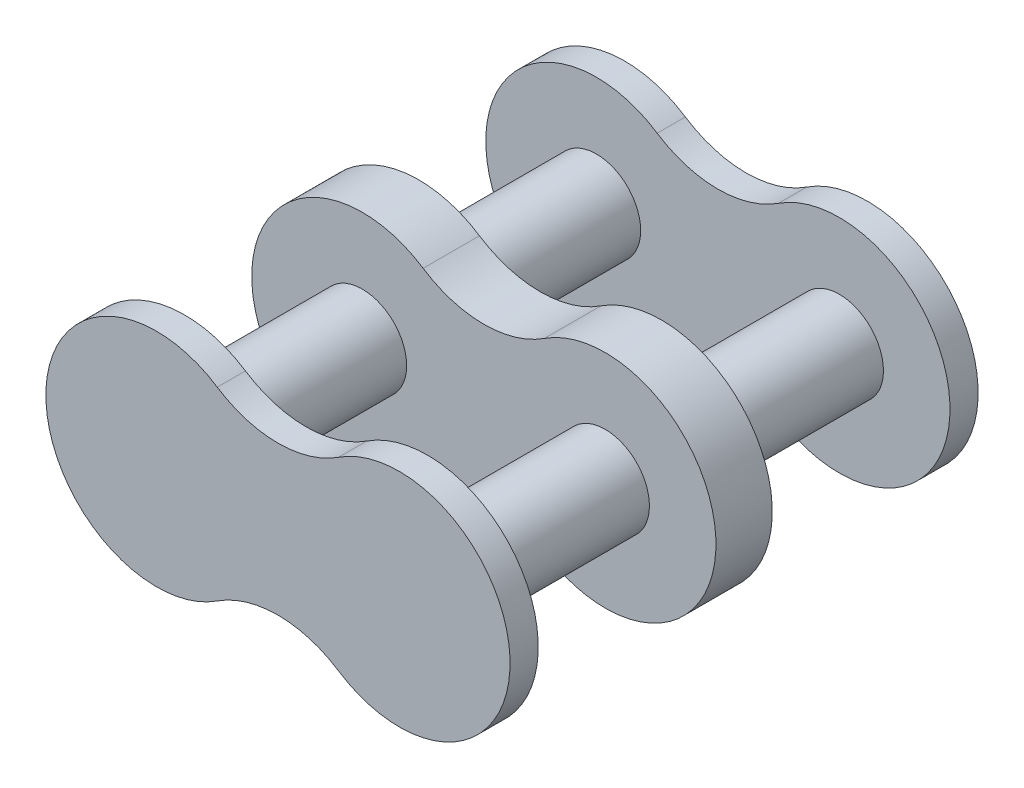
ISO-10303-21;
HEADER;
FILE_DESCRIPTION(('STEP AP214'),'2;1');
FILE_NAME('part.step','',(''),(''),'','','');
FILE_SCHEMA(('AUTOMOTIVE_DESIGN { 1 0 10303 214 1 1 1 1 }'));
ENDSEC;
DATA;
#1=APPLICATION_CONTEXT('core data for automotive mechanical design processes');
#2=APPLICATION_PROTOCOL_DEFINITION('international standard','automotive_design',2000,#1);
#3=PRODUCT_CONTEXT('',#1,'mechanical');
#4=PRODUCT('Part','Part','',(#3));
#5=PRODUCT_RELATED_PRODUCT_CATEGORY('part','',(#4));
#6=PRODUCT_DEFINITION_FORMATION('','',#4);
#7=PRODUCT_DEFINITION_CONTEXT('part definition',#1,'design');
#8=PRODUCT_DEFINITION('design','',#6,#7);
#9=PRODUCT_DEFINITION_SHAPE('','',#8);
#10=(LENGTH_UNIT() NAMED_UNIT(*) SI_UNIT(.MILLI.,.METRE.));
#11=(NAMED_UNIT(*) PLANE_ANGLE_UNIT() SI_UNIT($,.RADIAN.));
#12=(NAMED_UNIT(*) SI_UNIT($,.STERADIAN.) SOLID_ANGLE_UNIT());
#13=UNCERTAINTY_MEASURE_WITH_UNIT(LENGTH_MEASURE(1.E-05),#10,'distance_accuracy_value','');
#14=(GEOMETRIC_REPRESENTATION_CONTEXT(3) GLOBAL_UNCERTAINTY_ASSIGNED_CONTEXT((#13)) GLOBAL_UNIT_ASSIGNED_CONTEXT((#10,
#11,#12)) REPRESENTATION_CONTEXT('',''));
#15=CARTESIAN_POINT('',(0.,0.,0.));
#16=DIRECTION('',(0.,0.,1.));
#17=DIRECTION('',(1.,0.,0.));
#18=AXIS2_PLACEMENT_3D('',#15,#16,#17);
#19=CARTESIAN_POINT('',(0.,4.84328116466513,0.7366));
#20=DIRECTION('',(0.,0.,-1.));
#21=DIRECTION('',(-1.,0.,0.));
#22=AXIS2_PLACEMENT_3D('',#19,#20,#21);
#23=CYLINDRICAL_SURFACE('',#22,2.8956);
#24=CARTESIAN_POINT('',(0.,4.84328116466513,-0.7366));
#25=DIRECTION('',(0.,0.,-1.));
#26=DIRECTION('',(1.,0.,0.));
#27=AXIS2_PLACEMENT_3D('',#24,#25,#26);
#28=CIRCLE('',#27,2.8956);
#29=CARTESIAN_POINT('',(1.5875,2.42164058233256,-0.7366));
#30=VERTEX_POINT('',#29);
#31=CARTESIAN_POINT('',(-1.5875,2.42164058233256,-0.7366));
#32=VERTEX_POINT('',#31);
#33=EDGE_CURVE('E221',#30,#32,#28,.T.);
#34=ORIENTED_EDGE('',*,*,#33,.T.);
#35=DIRECTION('',(0.,0.,-1.));
#36=VECTOR('',#35,1.);
#37=CARTESIAN_POINT('',(-1.5875,2.42164058233256,0.7366));
#38=LINE('',#37,#36);
#39=CARTESIAN_POINT('',(-1.5875,2.42164058233256,0.7366));
#40=VERTEX_POINT('',#39);
#41=EDGE_CURVE('E240',#40,#32,#38,.T.);
#42=ORIENTED_EDGE('',*,*,#41,.F.);
#43=CARTESIAN_POINT('',(0.,4.84328116466513,0.7366));
#44=DIRECTION('',(0.,0.,-1.));
#45=DIRECTION('',(1.,0.,0.));
#46=AXIS2_PLACEMENT_3D('',#43,#44,#45);
#47=CIRCLE('',#46,2.8956);
#48=CARTESIAN_POINT('',(1.5875,2.42164058233256,0.7366));
#49=VERTEX_POINT('',#48);
#50=EDGE_CURVE('E222',#49,#40,#47,.T.);
#51=ORIENTED_EDGE('',*,*,#50,.F.);
#52=DIRECTION('',(0.,0.,-1.));
#53=VECTOR('',#52,1.);
#54=CARTESIAN_POINT('',(1.5875,2.42164058233256,0.7366));
#55=LINE('',#54,#53);
#56=EDGE_CURVE('E228',#49,#30,#55,.T.);
#57=ORIENTED_EDGE('',*,*,#56,.T.);
#58=EDGE_LOOP('',(#34,#42,#51,#57));
#59=FACE_BOUND('',#58,.T.);
#60=ADVANCED_FACE('F33',(#59),#23,.F.);
#61=CARTESIAN_POINT('',(-3.175,0.,0.7366));
#62=DIRECTION('',(0.,0.,-1.));
#63=DIRECTION('',(-1.,0.,0.));
#64=AXIS2_PLACEMENT_3D('',#61,#62,#63);
#65=CYLINDRICAL_SURFACE('',#64,2.8956);
#66=CARTESIAN_POINT('',(-3.175,0.,-0.7366));
#67=DIRECTION('',(0.,0.,1.));
#68=DIRECTION('',(1.,0.,0.));
#69=AXIS2_PLACEMENT_3D('',#66,#67,#68);
#70=CIRCLE('',#69,2.8956);
#71=CARTESIAN_POINT('',(-1.5875,-2.42164058233256,-0.7366));
#72=VERTEX_POINT('',#71);
#73=EDGE_CURVE('E231',#32,#72,#70,.T.);
#74=ORIENTED_EDGE('',*,*,#73,.T.);
#75=DIRECTION('',(0.,0.,-1.));
#76=VECTOR('',#75,1.);
#77=CARTESIAN_POINT('',(-1.5875,-2.42164058233256,0.7366));
#78=LINE('',#77,#76);
#79=CARTESIAN_POINT('',(-1.5875,-2.42164058233256,0.7366));
#80=VERTEX_POINT('',#79);
#81=EDGE_CURVE('E238',#80,#72,#78,.T.);
#82=ORIENTED_EDGE('',*,*,#81,.F.);
#83=CARTESIAN_POINT('',(-3.175,0.,0.7366));
#84=DIRECTION('',(0.,0.,1.));
#85=DIRECTION('',(1.,0.,0.));
#86=AXIS2_PLACEMENT_3D('',#83,#84,#85);
#87=CIRCLE('',#86,2.8956);
#88=EDGE_CURVE('E81',#40,#80,#87,.T.);
#89=ORIENTED_EDGE('',*,*,#88,.F.);
#90=ORIENTED_EDGE('',*,*,#41,.T.);
#91=EDGE_LOOP('',(#74,#82,#89,#90));
#92=FACE_BOUND('',#91,.T.);
#93=ADVANCED_FACE('F280',(#92),#65,.T.);
#94=CARTESIAN_POINT('',(0.,-4.84328116466513,0.7366));
#95=DIRECTION('',(0.,0.,-1.));
#96=DIRECTION('',(-1.,0.,0.));
#97=AXIS2_PLACEMENT_3D('',#94,#95,#96);
#98=CYLINDRICAL_SURFACE('',#97,2.8956);
#99=CARTESIAN_POINT('',(0.,-4.84328116466513,-0.7366));
#100=DIRECTION('',(0.,0.,-1.));
#101=DIRECTION('',(-1.,0.,0.));
#102=AXIS2_PLACEMENT_3D('',#99,#100,#101);
#103=CIRCLE('',#102,2.8956);
#104=CARTESIAN_POINT('',(1.5875,-2.42164058233256,-0.7366));
#105=VERTEX_POINT('',#104);
#106=EDGE_CURVE('E67',#72,#105,#103,.T.);
#107=ORIENTED_EDGE('',*,*,#106,.T.);
#108=DIRECTION('',(0.,0.,-1.));
#109=VECTOR('',#108,1.);
#110=CARTESIAN_POINT('',(1.5875,-2.42164058233256,0.7366));
#111=LINE('',#110,#109);
#112=CARTESIAN_POINT('',(1.5875,-2.42164058233256,0.7366));
#113=VERTEX_POINT('',#112);
#114=EDGE_CURVE('E236',#113,#105,#111,.T.);
#115=ORIENTED_EDGE('',*,*,#114,.F.);
#116=CARTESIAN_POINT('',(0.,-4.84328116466513,0.7366));
#117=DIRECTION('',(0.,0.,-1.));
#118=DIRECTION('',(-1.,0.,0.));
#119=AXIS2_PLACEMENT_3D('',#116,#117,#118);
#120=CIRCLE('',#119,2.8956);
#121=EDGE_CURVE('E225',#80,#113,#120,.T.);
#122=ORIENTED_EDGE('',*,*,#121,.F.);
#123=ORIENTED_EDGE('',*,*,#81,.T.);
#124=EDGE_LOOP('',(#107,#115,#122,#123));
#125=FACE_BOUND('',#124,.T.);
#126=ADVANCED_FACE('F285',(#125),#98,.F.);
#127=CARTESIAN_POINT('',(3.175,0.,0.7366));
#128=DIRECTION('',(0.,0.,-1.));
#129=DIRECTION('',(-1.,0.,0.));
#130=AXIS2_PLACEMENT_3D('',#127,#128,#129);
#131=CYLINDRICAL_SURFACE('',#130,2.8956);
#132=CARTESIAN_POINT('',(3.175,0.,-0.7366));
#133=DIRECTION('',(0.,0.,1.));
#134=DIRECTION('',(1.,0.,0.));
#135=AXIS2_PLACEMENT_3D('',#132,#133,#134);
#136=CIRCLE('',#135,2.8956);
#137=EDGE_CURVE('E73',#105,#30,#136,.T.);
#138=ORIENTED_EDGE('',*,*,#137,.T.);
#139=ORIENTED_EDGE('',*,*,#56,.F.);
#140=CARTESIAN_POINT('',(3.175,0.,0.7366));
#141=DIRECTION('',(0.,0.,1.));
#142=DIRECTION('',(1.,0.,0.));
#143=AXIS2_PLACEMENT_3D('',#140,#141,#142);
#144=CIRCLE('',#143,2.8956);
#145=EDGE_CURVE('E49',#113,#49,#144,.T.);
#146=ORIENTED_EDGE('',*,*,#145,.F.);
#147=ORIENTED_EDGE('',*,*,#114,.T.);
#148=EDGE_LOOP('',(#138,#139,#146,#147));
#149=FACE_BOUND('',#148,.T.);
#150=ADVANCED_FACE('F294',(#149),#131,.T.);
#151=CARTESIAN_POINT('',(1.5875,2.42164058233256,0.7366));
#152=DIRECTION('',(0.,0.,1.));
#153=DIRECTION('',(1.,0.,0.));
#154=AXIS2_PLACEMENT_3D('',#151,#152,#153);
#155=PLANE('',#154);
#156=CARTESIAN_POINT('',(3.175,0.,0.7366));
#157=DIRECTION('',(0.,0.,1.));
#158=DIRECTION('',(1.,0.,0.));
#159=AXIS2_PLACEMENT_3D('',#156,#157,#158);
#160=CIRCLE('',#159,1.1557);
#161=CARTESIAN_POINT('',(4.3307,0.,0.7366));
#162=VERTEX_POINT('',#161);
#163=EDGE_CURVE('E182',#162,#162,#160,.T.);
#164=ORIENTED_EDGE('',*,*,#163,.F.);
#165=EDGE_LOOP('',(#164));
#166=FACE_BOUND('',#165,.T.);
#167=CARTESIAN_POINT('',(-3.175,0.,0.7366));
#168=DIRECTION('',(0.,0.,1.));
#169=DIRECTION('',(1.,0.,0.));
#170=AXIS2_PLACEMENT_3D('',#167,#168,#169);
#171=CIRCLE('',#170,1.1557);
#172=CARTESIAN_POINT('',(-2.0193,0.,0.7366));
#173=VERTEX_POINT('',#172);
#174=EDGE_CURVE('E215',#173,#173,#171,.T.);
#175=ORIENTED_EDGE('',*,*,#174,.F.);
#176=EDGE_LOOP('',(#175));
#177=FACE_BOUND('',#176,.T.);
#178=ORIENTED_EDGE('',*,*,#50,.T.);
#179=ORIENTED_EDGE('',*,*,#88,.T.);
#180=ORIENTED_EDGE('',*,*,#121,.T.);
#181=ORIENTED_EDGE('',*,*,#145,.T.);
#182=EDGE_LOOP('',(#178,#179,#180,#181));
#183=FACE_BOUND('',#182,.T.);
#184=ADVANCED_FACE('F292',(#166,#177,#183),#155,.T.);
#185=CARTESIAN_POINT('',(1.5875,2.42164058233256,-0.7366));
#186=DIRECTION('',(0.,0.,1.));
#187=DIRECTION('',(1.,0.,0.));
#188=AXIS2_PLACEMENT_3D('',#185,#186,#187);
#189=PLANE('',#188);
#190=CARTESIAN_POINT('',(3.175,0.,-0.7366));
#191=DIRECTION('',(0.,0.,1.));
#192=DIRECTION('',(1.,0.,0.));
#193=AXIS2_PLACEMENT_3D('',#190,#191,#192);
#194=CIRCLE('',#193,1.1557);
#195=CARTESIAN_POINT('',(4.3307,0.,-0.7366));
#196=VERTEX_POINT('',#195);
#197=EDGE_CURVE('E163',#196,#196,#194,.T.);
#198=ORIENTED_EDGE('',*,*,#197,.T.);
#199=EDGE_LOOP('',(#198));
#200=FACE_BOUND('',#199,.T.);
#201=CARTESIAN_POINT('',(-3.175,0.,-0.7366));
#202=DIRECTION('',(0.,0.,1.));
#203=DIRECTION('',(1.,0.,0.));
#204=AXIS2_PLACEMENT_3D('',#201,#202,#203);
#205=CIRCLE('',#204,1.1557);
#206=CARTESIAN_POINT('',(-2.0193,0.,-0.7366));
#207=VERTEX_POINT('',#206);
#208=EDGE_CURVE('E179',#207,#207,#205,.T.);
#209=ORIENTED_EDGE('',*,*,#208,.T.);
#210=EDGE_LOOP('',(#209));
#211=FACE_BOUND('',#210,.T.);
#212=ORIENTED_EDGE('',*,*,#33,.F.);
#213=ORIENTED_EDGE('',*,*,#137,.F.);
#214=ORIENTED_EDGE('',*,*,#106,.F.);
#215=ORIENTED_EDGE('',*,*,#73,.F.);
#216=EDGE_LOOP('',(#212,#213,#214,#215));
#217=FACE_BOUND('',#216,.T.);
#218=ADVANCED_FACE('F290',(#200,#211,#217),#189,.F.);
#219=CARTESIAN_POINT('',(-3.175,0.,8.65361322806917));
#220=DIRECTION('',(0.,0.,-1.));
#221=DIRECTION('',(-1.,0.,0.));
#222=AXIS2_PLACEMENT_3D('',#219,#220,#221);
#223=CYLINDRICAL_SURFACE('',#222,1.1557);
#224=ORIENTED_EDGE('',*,*,#174,.T.);
#225=EDGE_LOOP('',(#224));
#226=FACE_BOUND('',#225,.T.);
#227=CARTESIAN_POINT('',(-3.175,0.,5.3848));
#228=DIRECTION('',(0.,0.,1.));
#229=DIRECTION('',(1.,0.,0.));
#230=AXIS2_PLACEMENT_3D('',#227,#228,#229);
#231=CIRCLE('',#230,1.1557);
#232=CARTESIAN_POINT('',(-2.0193,0.,5.3848));
#233=VERTEX_POINT('',#232);
#234=EDGE_CURVE('E218',#233,#233,#231,.T.);
#235=ORIENTED_EDGE('',*,*,#234,.F.);
#236=EDGE_LOOP('',(#235));
#237=FACE_BOUND('',#236,.T.);
#238=ADVANCED_FACE('F301',(#226,#237),#223,.T.);
#239=CARTESIAN_POINT('',(0.,4.84328116466513,6.1214));
#240=DIRECTION('',(0.,0.,-1.));
#241=DIRECTION('',(-1.,0.,0.));
#242=AXIS2_PLACEMENT_3D('',#239,#240,#241);
#243=CYLINDRICAL_SURFACE('',#242,2.8956);
#244=CARTESIAN_POINT('',(0.,4.84328116466513,5.3848));
#245=DIRECTION('',(0.,0.,-1.));
#246=DIRECTION('',(1.,0.,0.));
#247=AXIS2_PLACEMENT_3D('',#244,#245,#246);
#248=CIRCLE('',#247,2.8956);
#249=CARTESIAN_POINT('',(1.5875,2.42164058233256,5.3848));
#250=VERTEX_POINT('',#249);
#251=CARTESIAN_POINT('',(-1.5875,2.42164058233256,5.3848));
#252=VERTEX_POINT('',#251);
#253=EDGE_CURVE('E185',#250,#252,#248,.T.);
#254=ORIENTED_EDGE('',*,*,#253,.T.);
#255=DIRECTION('',(0.,0.,-1.));
#256=VECTOR('',#255,1.);
#257=CARTESIAN_POINT('',(-1.5875,2.42164058233256,6.1214));
#258=LINE('',#257,#256);
#259=CARTESIAN_POINT('',(-1.5875,2.42164058233256,6.1214));
#260=VERTEX_POINT('',#259);
#261=EDGE_CURVE('E212',#260,#252,#258,.T.);
#262=ORIENTED_EDGE('',*,*,#261,.F.);
#263=CARTESIAN_POINT('',(0.,4.84328116466513,6.1214));
#264=DIRECTION('',(0.,0.,-1.));
#265=DIRECTION('',(1.,0.,0.));
#266=AXIS2_PLACEMENT_3D('',#263,#264,#265);
#267=CIRCLE('',#266,2.8956);
#268=CARTESIAN_POINT('',(1.5875,2.42164058233256,6.1214));
#269=VERTEX_POINT('',#268);
#270=EDGE_CURVE('E186',#269,#260,#267,.T.);
#271=ORIENTED_EDGE('',*,*,#270,.F.);
#272=DIRECTION('',(0.,0.,-1.));
#273=VECTOR('',#272,1.);
#274=CARTESIAN_POINT('',(1.5875,2.42164058233256,6.1214));
#275=LINE('',#274,#273);
#276=EDGE_CURVE('E196',#269,#250,#275,.T.);
#277=ORIENTED_EDGE('',*,*,#276,.T.);
#278=EDGE_LOOP('',(#254,#262,#271,#277));
#279=FACE_BOUND('',#278,.T.);
#280=ADVANCED_FACE('F258',(#279),#243,.F.);
#281=CARTESIAN_POINT('',(-3.175,0.,6.1214));
#282=DIRECTION('',(0.,0.,-1.));
#283=DIRECTION('',(-1.,0.,0.));
#284=AXIS2_PLACEMENT_3D('',#281,#282,#283);
#285=CYLINDRICAL_SURFACE('',#284,2.8956);
#286=CARTESIAN_POINT('',(-3.175,0.,5.3848));
#287=DIRECTION('',(0.,0.,1.));
#288=DIRECTION('',(1.,0.,0.));
#289=AXIS2_PLACEMENT_3D('',#286,#287,#288);
#290=CIRCLE('',#289,2.8956);
#291=CARTESIAN_POINT('',(-1.5875,-2.42164058233256,5.3848));
#292=VERTEX_POINT('',#291);
#293=EDGE_CURVE('E199',#252,#292,#290,.T.);
#294=ORIENTED_EDGE('',*,*,#293,.T.);
#295=DIRECTION('',(0.,0.,-1.));
#296=VECTOR('',#295,1.);
#297=CARTESIAN_POINT('',(-1.5875,-2.42164058233256,6.1214));
#298=LINE('',#297,#296);
#299=CARTESIAN_POINT('',(-1.5875,-2.42164058233256,6.1214));
#300=VERTEX_POINT('',#299);
#301=EDGE_CURVE('E209',#300,#292,#298,.T.);
#302=ORIENTED_EDGE('',*,*,#301,.F.);
#303=CARTESIAN_POINT('',(-3.175,0.,6.1214));
#304=DIRECTION('',(0.,0.,1.));
#305=DIRECTION('',(1.,0.,0.));
#306=AXIS2_PLACEMENT_3D('',#303,#304,#305);
#307=CIRCLE('',#306,2.8956);
#308=EDGE_CURVE('E189',#260,#300,#307,.T.);
#309=ORIENTED_EDGE('',*,*,#308,.F.);
#310=ORIENTED_EDGE('',*,*,#261,.T.);
#311=EDGE_LOOP('',(#294,#302,#309,#310));
#312=FACE_BOUND('',#311,.T.);
#313=ADVANCED_FACE('F270',(#312),#285,.T.);
#314=CARTESIAN_POINT('',(0.,-4.84328116466513,6.1214));
#315=DIRECTION('',(0.,0.,-1.));
#316=DIRECTION('',(-1.,0.,0.));
#317=AXIS2_PLACEMENT_3D('',#314,#315,#316);
#318=CYLINDRICAL_SURFACE('',#317,2.8956);
#319=CARTESIAN_POINT('',(0.,-4.84328116466513,5.3848));
#320=DIRECTION('',(0.,0.,-1.));
#321=DIRECTION('',(-1.,0.,0.));
#322=AXIS2_PLACEMENT_3D('',#319,#320,#321);
#323=CIRCLE('',#322,2.8956);
#324=CARTESIAN_POINT('',(1.5875,-2.42164058233256,5.3848));
#325=VERTEX_POINT('',#324);
#326=EDGE_CURVE('E201',#292,#325,#323,.T.);
#327=ORIENTED_EDGE('',*,*,#326,.T.);
#328=DIRECTION('',(0.,0.,-1.));
#329=VECTOR('',#328,1.);
#330=CARTESIAN_POINT('',(1.5875,-2.42164058233256,6.1214));
#331=LINE('',#330,#329);
#332=CARTESIAN_POINT('',(1.5875,-2.42164058233256,6.1214));
#333=VERTEX_POINT('',#332);
#334=EDGE_CURVE('E206',#333,#325,#331,.T.);
#335=ORIENTED_EDGE('',*,*,#334,.F.);
#336=CARTESIAN_POINT('',(0.,-4.84328116466513,6.1214));
#337=DIRECTION('',(0.,0.,-1.));
#338=DIRECTION('',(-1.,0.,0.));
#339=AXIS2_PLACEMENT_3D('',#336,#337,#338);
#340=CIRCLE('',#339,2.8956);
#341=EDGE_CURVE('E192',#300,#333,#340,.T.);
#342=ORIENTED_EDGE('',*,*,#341,.F.);
#343=ORIENTED_EDGE('',*,*,#301,.T.);
#344=EDGE_LOOP('',(#327,#335,#342,#343));
#345=FACE_BOUND('',#344,.T.);
#346=ADVANCED_FACE('F267',(#345),#318,.F.);
#347=CARTESIAN_POINT('',(3.175,0.,6.1214));
#348=DIRECTION('',(0.,0.,-1.));
#349=DIRECTION('',(-1.,0.,0.));
#350=AXIS2_PLACEMENT_3D('',#347,#348,#349);
#351=CYLINDRICAL_SURFACE('',#350,2.8956);
#352=CARTESIAN_POINT('',(3.175,0.,5.3848));
#353=DIRECTION('',(0.,0.,1.));
#354=DIRECTION('',(1.,0.,0.));
#355=AXIS2_PLACEMENT_3D('',#352,#353,#354);
#356=CIRCLE('',#355,2.8956);
#357=EDGE_CURVE('E190',#325,#250,#356,.T.);
#358=ORIENTED_EDGE('',*,*,#357,.T.);
#359=ORIENTED_EDGE('',*,*,#276,.F.);
#360=CARTESIAN_POINT('',(3.175,0.,6.1214));
#361=DIRECTION('',(0.,0.,1.));
#362=DIRECTION('',(1.,0.,0.));
#363=AXIS2_PLACEMENT_3D('',#360,#361,#362);
#364=CIRCLE('',#363,2.8956);
#365=EDGE_CURVE('E194',#333,#269,#364,.T.);
#366=ORIENTED_EDGE('',*,*,#365,.F.);
#367=ORIENTED_EDGE('',*,*,#334,.T.);
#368=EDGE_LOOP('',(#358,#359,#366,#367));
#369=FACE_BOUND('',#368,.T.);
#370=ADVANCED_FACE('F263',(#369),#351,.T.);
#371=CARTESIAN_POINT('',(1.5875,2.42164058233256,6.1214));
#372=DIRECTION('',(0.,0.,1.));
#373=DIRECTION('',(1.,0.,0.));
#374=AXIS2_PLACEMENT_3D('',#371,#372,#373);
#375=PLANE('',#374);
#376=ORIENTED_EDGE('',*,*,#270,.T.);
#377=ORIENTED_EDGE('',*,*,#308,.T.);
#378=ORIENTED_EDGE('',*,*,#341,.T.);
#379=ORIENTED_EDGE('',*,*,#365,.T.);
#380=EDGE_LOOP('',(#376,#377,#378,#379));
#381=FACE_BOUND('',#380,.T.);
#382=ADVANCED_FACE('F249',(#381),#375,.T.);
#383=CARTESIAN_POINT('',(1.5875,2.42164058233256,5.3848));
#384=DIRECTION('',(0.,0.,1.));
#385=DIRECTION('',(1.,0.,0.));
#386=AXIS2_PLACEMENT_3D('',#383,#384,#385);
#387=PLANE('',#386);
#388=CARTESIAN_POINT('',(3.175,0.,5.3848));
#389=DIRECTION('',(0.,0.,1.));
#390=DIRECTION('',(1.,0.,0.));
#391=AXIS2_PLACEMENT_3D('',#388,#389,#390);
#392=CIRCLE('',#391,1.1557);
#393=CARTESIAN_POINT('',(4.3307,0.,5.3848));
#394=VERTEX_POINT('',#393);
#395=EDGE_CURVE('E41',#394,#394,#392,.F.);
#396=ORIENTED_EDGE('',*,*,#395,.F.);
#397=EDGE_LOOP('',(#396));
#398=FACE_BOUND('',#397,.T.);
#399=ORIENTED_EDGE('',*,*,#234,.T.);
#400=EDGE_LOOP('',(#399));
#401=FACE_BOUND('',#400,.T.);
#402=ORIENTED_EDGE('',*,*,#253,.F.);
#403=ORIENTED_EDGE('',*,*,#357,.F.);
#404=ORIENTED_EDGE('',*,*,#326,.F.);
#405=ORIENTED_EDGE('',*,*,#293,.F.);
#406=EDGE_LOOP('',(#402,#403,#404,#405));
#407=FACE_BOUND('',#406,.T.);
#408=ADVANCED_FACE('F246',(#398,#401,#407),#387,.F.);
#409=CARTESIAN_POINT('',(3.175,0.,8.65361322806917));
#410=DIRECTION('',(0.,0.,-1.));
#411=DIRECTION('',(-1.,0.,0.));
#412=AXIS2_PLACEMENT_3D('',#409,#410,#411);
#413=CYLINDRICAL_SURFACE('',#412,1.1557);
#414=ORIENTED_EDGE('',*,*,#163,.T.);
#415=EDGE_LOOP('',(#414));
#416=FACE_BOUND('',#415,.T.);
#417=ORIENTED_EDGE('',*,*,#395,.T.);
#418=EDGE_LOOP('',(#417));
#419=FACE_BOUND('',#418,.T.);
#420=ADVANCED_FACE('F244',(#416,#419),#413,.T.);
#421=CARTESIAN_POINT('',(-3.175,0.,-5.3848));
#422=DIRECTION('',(0.,0.,1.));
#423=DIRECTION('',(1.,0.,0.));
#424=AXIS2_PLACEMENT_3D('',#421,#422,#423);
#425=CYLINDRICAL_SURFACE('',#424,1.1557);
#426=CARTESIAN_POINT('',(-3.175,0.,-5.3848));
#427=DIRECTION('',(0.,0.,1.));
#428=DIRECTION('',(1.,0.,0.));
#429=AXIS2_PLACEMENT_3D('',#426,#427,#428);
#430=CIRCLE('',#429,1.1557);
#431=CARTESIAN_POINT('',(-2.0193,0.,-5.3848));
#432=VERTEX_POINT('',#431);
#433=EDGE_CURVE('E173',#432,#432,#430,.T.);
#434=CARTESIAN_POINT('',(-2.0193,0.,-5.3848));
#435=CARTESIAN_POINT('',(-2.0193,0.,-5.33638125));
#436=CARTESIAN_POINT('',(-2.0193,0.,-5.2879625));
#437=CARTESIAN_POINT('',(-2.0193,0.,-5.191125));
#438=CARTESIAN_POINT('',(-2.0193,0.,-5.14270625));
#439=CARTESIAN_POINT('',(-2.0193,0.,-5.04586875));
#440=CARTESIAN_POINT('',(-2.0193,0.,-4.99745));
#441=CARTESIAN_POINT('',(-2.0193,0.,-4.9006125));
#442=CARTESIAN_POINT('',(-2.0193,0.,-4.85219375));
#443=CARTESIAN_POINT('',(-2.0193,0.,-4.75535625));
#444=CARTESIAN_POINT('',(-2.0193,0.,-4.7069375));
#445=CARTESIAN_POINT('',(-2.0193,0.,-4.6101));
#446=CARTESIAN_POINT('',(-2.0193,0.,-4.56168125));
#447=CARTESIAN_POINT('',(-2.0193,0.,-4.46484375));
#448=CARTESIAN_POINT('',(-2.0193,0.,-4.416425));
#449=CARTESIAN_POINT('',(-2.0193,0.,-4.3195875));
#450=CARTESIAN_POINT('',(-2.0193,0.,-4.27116875));
#451=CARTESIAN_POINT('',(-2.0193,0.,-4.17433125));
#452=CARTESIAN_POINT('',(-2.0193,0.,-4.1259125));
#453=CARTESIAN_POINT('',(-2.0193,0.,-4.029075));
#454=CARTESIAN_POINT('',(-2.0193,0.,-3.98065625));
#455=CARTESIAN_POINT('',(-2.0193,0.,-3.88381875));
#456=CARTESIAN_POINT('',(-2.0193,0.,-3.8354));
#457=CARTESIAN_POINT('',(-2.0193,0.,-3.7385625));
#458=CARTESIAN_POINT('',(-2.0193,0.,-3.69014375));
#459=CARTESIAN_POINT('',(-2.0193,0.,-3.59330625));
#460=CARTESIAN_POINT('',(-2.0193,0.,-3.5448875));
#461=CARTESIAN_POINT('',(-2.0193,0.,-3.44805));
#462=CARTESIAN_POINT('',(-2.0193,0.,-3.39963125));
#463=CARTESIAN_POINT('',(-2.0193,0.,-3.30279375));
#464=CARTESIAN_POINT('',(-2.0193,0.,-3.254375));
#465=CARTESIAN_POINT('',(-2.0193,0.,-3.1575375));
#466=CARTESIAN_POINT('',(-2.0193,0.,-3.10911875));
#467=CARTESIAN_POINT('',(-2.0193,0.,-3.01228125));
#468=CARTESIAN_POINT('',(-2.0193,0.,-2.9638625));
#469=CARTESIAN_POINT('',(-2.0193,0.,-2.867025));
#470=CARTESIAN_POINT('',(-2.0193,0.,-2.81860625));
#471=CARTESIAN_POINT('',(-2.0193,0.,-2.72176875));
#472=CARTESIAN_POINT('',(-2.0193,0.,-2.67335));
#473=CARTESIAN_POINT('',(-2.0193,0.,-2.5765125));
#474=CARTESIAN_POINT('',(-2.0193,0.,-2.52809375));
#475=CARTESIAN_POINT('',(-2.0193,0.,-2.43125625));
#476=CARTESIAN_POINT('',(-2.0193,0.,-2.3828375));
#477=CARTESIAN_POINT('',(-2.0193,0.,-2.286));
#478=CARTESIAN_POINT('',(-2.0193,0.,-2.23758125));
#479=CARTESIAN_POINT('',(-2.0193,0.,-2.14074375));
#480=CARTESIAN_POINT('',(-2.0193,0.,-2.092325));
#481=CARTESIAN_POINT('',(-2.0193,0.,-1.9954875));
#482=CARTESIAN_POINT('',(-2.0193,0.,-1.94706875));
#483=CARTESIAN_POINT('',(-2.0193,0.,-1.85023125));
#484=CARTESIAN_POINT('',(-2.0193,0.,-1.8018125));
#485=CARTESIAN_POINT('',(-2.0193,0.,-1.704975));
#486=CARTESIAN_POINT('',(-2.0193,0.,-1.65655625));
#487=CARTESIAN_POINT('',(-2.0193,0.,-1.55971875));
#488=CARTESIAN_POINT('',(-2.0193,0.,-1.5113));
#489=CARTESIAN_POINT('',(-2.0193,0.,-1.4144625));
#490=CARTESIAN_POINT('',(-2.0193,0.,-1.36604375));
#491=CARTESIAN_POINT('',(-2.0193,0.,-1.26920625));
#492=CARTESIAN_POINT('',(-2.0193,0.,-1.2207875));
#493=CARTESIAN_POINT('',(-2.0193,0.,-1.12395));
#494=CARTESIAN_POINT('',(-2.0193,0.,-1.07553125));
#495=CARTESIAN_POINT('',(-2.0193,0.,-0.97869375));
#496=CARTESIAN_POINT('',(-2.0193,0.,-0.930275));
#497=CARTESIAN_POINT('',(-2.0193,0.,-0.833437499999999));
#498=CARTESIAN_POINT('',(-2.0193,0.,-0.785018749999999));
#499=CARTESIAN_POINT('',(-2.0193,0.,-0.7366));
#500=B_SPLINE_CURVE_WITH_KNOTS('',3,(#434,#435,#436,#437,#438,#439,#440,#441,#442,#443,#444,
#445,#446,#447,#448,#449,#450,#451,#452,#453,#454,#455,#456,#457,#458,#459,#460,#461,#462,#463,
#464,#465,#466,#467,#468,#469,#470,#471,#472,#473,#474,#475,#476,#477,#478,#479,#480,#481,#482,
#483,#484,#485,#486,#487,#488,#489,#490,#491,#492,#493,#494,#495,#496,#497,#498,#499),
.UNSPECIFIED.,.F.,.F.,(4,2,2,2,2,2,2,2,2,2,2,2,2,2,2,2,2,2,2,2,2,2,2,2,2,2,2,2,2,2,2,2,4),(0.,
0.145256250000001,0.2905125,0.435768750000001,0.581025000000001,0.72628125,0.871537500000001,
1.01679375,1.16205,1.30730625,1.4525625,1.59781875,1.743075,1.88833125,2.0335875,2.17884375,
2.3241,2.46935625,2.6146125,2.75986875,2.905125,3.05038125,3.1956375,3.34089375,3.48615,
3.63140625,3.7766625,3.92191875,4.067175,4.21243125,4.3576875,4.50294375,4.6482),.UNSPECIFIED.);
#501=EDGE_CURVE('BSEAM380',#432,#207,#500,.T.);
#502=ORIENTED_EDGE('',*,*,#433,.T.);
#503=ORIENTED_EDGE('',*,*,#208,.F.);
#504=ORIENTED_EDGE('',*,*,#501,.T.);
#505=ORIENTED_EDGE('',*,*,#501,.F.);
#506=EDGE_LOOP('',(#502,#504,#503,#505));
#507=FACE_BOUND('',#506,.T.);
#508=ADVANCED_FACE('F380',(#507),#425,.T.);
#509=CARTESIAN_POINT('',(0.,4.84328116466513,-6.1214));
#510=DIRECTION('',(0.,0.,1.));
#511=DIRECTION('',(1.,0.,0.));
#512=AXIS2_PLACEMENT_3D('',#509,#510,#511);
#513=CYLINDRICAL_SURFACE('',#512,2.8956);
#514=CARTESIAN_POINT('',(0.,4.84328116466513,-5.3848));
#515=DIRECTION('',(0.,0.,-1.));
#516=DIRECTION('',(1.,0.,0.));
#517=AXIS2_PLACEMENT_3D('',#514,#515,#516);
#518=CIRCLE('',#517,2.8956);
#519=CARTESIAN_POINT('',(1.5875,2.42164058233256,-5.3848));
#520=VERTEX_POINT('',#519);
#521=CARTESIAN_POINT('',(-1.5875,2.42164058233256,-5.3848));
#522=VERTEX_POINT('',#521);
#523=EDGE_CURVE('E167',#520,#522,#518,.T.);
#524=ORIENTED_EDGE('',*,*,#523,.F.);
#525=DIRECTION('',(0.,0.,1.));
#526=VECTOR('',#525,1.);
#527=CARTESIAN_POINT('',(1.5875,2.42164058233256,-6.1214));
#528=LINE('',#527,#526);
#529=CARTESIAN_POINT('',(1.5875,2.42164058233256,-6.1214));
#530=VERTEX_POINT('',#529);
#531=EDGE_CURVE('E156',#530,#520,#528,.T.);
#532=ORIENTED_EDGE('',*,*,#531,.F.);
#533=CARTESIAN_POINT('',(0.,4.84328116466513,-6.1214));
#534=DIRECTION('',(0.,0.,-1.));
#535=DIRECTION('',(1.,0.,0.));
#536=AXIS2_PLACEMENT_3D('',#533,#534,#535);
#537=CIRCLE('',#536,2.8956);
#538=CARTESIAN_POINT('',(-1.5875,2.42164058233256,-6.1214));
#539=VERTEX_POINT('',#538);
#540=EDGE_CURVE('E150',#530,#539,#537,.T.);
#541=ORIENTED_EDGE('',*,*,#540,.T.);
#542=DIRECTION('',(0.,0.,1.));
#543=VECTOR('',#542,1.);
#544=CARTESIAN_POINT('',(-1.5875,2.42164058233256,-6.1214));
#545=LINE('',#544,#543);
#546=EDGE_CURVE('E132',#539,#522,#545,.T.);
#547=ORIENTED_EDGE('',*,*,#546,.T.);
#548=EDGE_LOOP('',(#524,#532,#541,#547));
#549=FACE_BOUND('',#548,.T.);
#550=ADVANCED_FACE('F155',(#549),#513,.F.);
#551=CARTESIAN_POINT('',(3.175,0.,-6.1214));
#552=DIRECTION('',(0.,0.,1.));
#553=DIRECTION('',(1.,0.,0.));
#554=AXIS2_PLACEMENT_3D('',#551,#552,#553);
#555=CYLINDRICAL_SURFACE('',#554,2.8956);
#556=CARTESIAN_POINT('',(3.175,0.,-5.3848));
#557=DIRECTION('',(0.,0.,1.));
#558=DIRECTION('',(1.,0.,0.));
#559=AXIS2_PLACEMENT_3D('',#556,#557,#558);
#560=CIRCLE('',#559,2.8956);
#561=CARTESIAN_POINT('',(1.5875,-2.42164058233256,-5.3848));
#562=VERTEX_POINT('',#561);
#563=EDGE_CURVE('E157',#562,#520,#560,.T.);
#564=ORIENTED_EDGE('',*,*,#563,.F.);
#565=DIRECTION('',(0.,0.,1.));
#566=VECTOR('',#565,1.);
#567=CARTESIAN_POINT('',(1.5875,-2.42164058233256,-6.1214));
#568=LINE('',#567,#566);
#569=CARTESIAN_POINT('',(1.5875,-2.42164058233256,-6.1214));
#570=VERTEX_POINT('',#569);
#571=EDGE_CURVE('E174',#570,#562,#568,.T.);
#572=ORIENTED_EDGE('',*,*,#571,.F.);
#573=CARTESIAN_POINT('',(3.175,0.,-6.1214));
#574=DIRECTION('',(0.,0.,1.));
#575=DIRECTION('',(1.,0.,0.));
#576=AXIS2_PLACEMENT_3D('',#573,#574,#575);
#577=CIRCLE('',#576,2.8956);
#578=EDGE_CURVE('E143',#570,#530,#577,.T.);
#579=ORIENTED_EDGE('',*,*,#578,.T.);
#580=ORIENTED_EDGE('',*,*,#531,.T.);
#581=EDGE_LOOP('',(#564,#572,#579,#580));
#582=FACE_BOUND('',#581,.T.);
#583=ADVANCED_FACE('F405',(#582),#555,.T.);
#584=CARTESIAN_POINT('',(0.,-4.84328116466513,-6.1214));
#585=DIRECTION('',(0.,0.,1.));
#586=DIRECTION('',(1.,0.,0.));
#587=AXIS2_PLACEMENT_3D('',#584,#585,#586);
#588=CYLINDRICAL_SURFACE('',#587,2.8956);
#589=CARTESIAN_POINT('',(0.,-4.84328116466513,-5.3848));
#590=DIRECTION('',(0.,0.,-1.));
#591=DIRECTION('',(-1.,0.,0.));
#592=AXIS2_PLACEMENT_3D('',#589,#590,#591);
#593=CIRCLE('',#592,2.8956);
#594=CARTESIAN_POINT('',(-1.5875,-2.42164058233256,-5.3848));
#595=VERTEX_POINT('',#594);
#596=EDGE_CURVE('E160',#595,#562,#593,.T.);
#597=ORIENTED_EDGE('',*,*,#596,.F.);
#598=DIRECTION('',(0.,0.,1.));
#599=VECTOR('',#598,1.);
#600=CARTESIAN_POINT('',(-1.5875,-2.42164058233256,-6.1214));
#601=LINE('',#600,#599);
#602=CARTESIAN_POINT('',(-1.5875,-2.42164058233256,-6.1214));
#603=VERTEX_POINT('',#602);
#604=EDGE_CURVE('E142',#603,#595,#601,.T.);
#605=ORIENTED_EDGE('',*,*,#604,.F.);
#606=CARTESIAN_POINT('',(0.,-4.84328116466513,-6.1214));
#607=DIRECTION('',(0.,0.,-1.));
#608=DIRECTION('',(-1.,0.,0.));
#609=AXIS2_PLACEMENT_3D('',#606,#607,#608);
#610=CIRCLE('',#609,2.8956);
#611=EDGE_CURVE('E153',#603,#570,#610,.T.);
#612=ORIENTED_EDGE('',*,*,#611,.T.);
#613=ORIENTED_EDGE('',*,*,#571,.T.);
#614=EDGE_LOOP('',(#597,#605,#612,#613));
#615=FACE_BOUND('',#614,.T.);
#616=ADVANCED_FACE('F414',(#615),#588,.F.);
#617=CARTESIAN_POINT('',(-3.175,0.,-6.1214));
#618=DIRECTION('',(0.,0.,1.));
#619=DIRECTION('',(1.,0.,0.));
#620=AXIS2_PLACEMENT_3D('',#617,#618,#619);
#621=CYLINDRICAL_SURFACE('',#620,2.8956);
#622=CARTESIAN_POINT('',(-3.175,0.,-5.3848));
#623=DIRECTION('',(0.,0.,1.));
#624=DIRECTION('',(1.,0.,0.));
#625=AXIS2_PLACEMENT_3D('',#622,#623,#624);
#626=CIRCLE('',#625,2.8956);
#627=EDGE_CURVE('E137',#522,#595,#626,.T.);
#628=ORIENTED_EDGE('',*,*,#627,.F.);
#629=ORIENTED_EDGE('',*,*,#546,.F.);
#630=CARTESIAN_POINT('',(-3.175,0.,-6.1214));
#631=DIRECTION('',(0.,0.,1.));
#632=DIRECTION('',(1.,0.,0.));
#633=AXIS2_PLACEMENT_3D('',#630,#631,#632);
#634=CIRCLE('',#633,2.8956);
#635=EDGE_CURVE('E135',#539,#603,#634,.T.);
#636=ORIENTED_EDGE('',*,*,#635,.T.);
#637=ORIENTED_EDGE('',*,*,#604,.T.);
#638=EDGE_LOOP('',(#628,#629,#636,#637));
#639=FACE_BOUND('',#638,.T.);
#640=ADVANCED_FACE('F134',(#639),#621,.T.);
#641=CARTESIAN_POINT('',(1.5875,2.42164058233256,-6.1214));
#642=DIRECTION('',(0.,0.,1.));
#643=DIRECTION('',(1.,0.,0.));
#644=AXIS2_PLACEMENT_3D('',#641,#642,#643);
#645=PLANE('',#644);
#646=ORIENTED_EDGE('',*,*,#540,.F.);
#647=ORIENTED_EDGE('',*,*,#578,.F.);
#648=ORIENTED_EDGE('',*,*,#611,.F.);
#649=ORIENTED_EDGE('',*,*,#635,.F.);
#650=EDGE_LOOP('',(#646,#647,#648,#649));
#651=FACE_BOUND('',#650,.T.);
#652=ADVANCED_FACE('F148',(#651),#645,.F.);
#653=CARTESIAN_POINT('',(1.5875,2.42164058233256,-5.3848));
#654=DIRECTION('',(0.,0.,1.));
#655=DIRECTION('',(1.,0.,0.));
#656=AXIS2_PLACEMENT_3D('',#653,#654,#655);
#657=PLANE('',#656);
#658=CARTESIAN_POINT('',(3.175,0.,-5.3848));
#659=DIRECTION('',(0.,0.,1.));
#660=DIRECTION('',(1.,0.,0.));
#661=AXIS2_PLACEMENT_3D('',#658,#659,#660);
#662=CIRCLE('',#661,1.1557);
#663=CARTESIAN_POINT('',(4.3307,0.,-5.3848));
#664=VERTEX_POINT('',#663);
#665=EDGE_CURVE('E11',#664,#664,#662,.T.);
#666=ORIENTED_EDGE('',*,*,#665,.F.);
#667=EDGE_LOOP('',(#666));
#668=FACE_BOUND('',#667,.T.);
#669=ORIENTED_EDGE('',*,*,#433,.F.);
#670=EDGE_LOOP('',(#669));
#671=FACE_BOUND('',#670,.T.);
#672=ORIENTED_EDGE('',*,*,#523,.T.);
#673=ORIENTED_EDGE('',*,*,#627,.T.);
#674=ORIENTED_EDGE('',*,*,#596,.T.);
#675=ORIENTED_EDGE('',*,*,#563,.T.);
#676=EDGE_LOOP('',(#672,#673,#674,#675));
#677=FACE_BOUND('',#676,.T.);
#678=ADVANCED_FACE('F441',(#668,#671,#677),#657,.T.);
#679=CARTESIAN_POINT('',(3.175,0.,-5.3848));
#680=DIRECTION('',(0.,0.,1.));
#681=DIRECTION('',(1.,0.,0.));
#682=AXIS2_PLACEMENT_3D('',#679,#680,#681);
#683=CYLINDRICAL_SURFACE('',#682,1.1557);
#684=CARTESIAN_POINT('',(4.3307,0.,-5.3848));
#685=CARTESIAN_POINT('',(4.3307,0.,-5.33638125));
#686=CARTESIAN_POINT('',(4.3307,0.,-5.2879625));
#687=CARTESIAN_POINT('',(4.3307,0.,-5.191125));
#688=CARTESIAN_POINT('',(4.3307,0.,-5.14270625));
#689=CARTESIAN_POINT('',(4.3307,0.,-5.04586875));
#690=CARTESIAN_POINT('',(4.3307,0.,-4.99745));
#691=CARTESIAN_POINT('',(4.3307,0.,-4.9006125));
#692=CARTESIAN_POINT('',(4.3307,0.,-4.85219375));
#693=CARTESIAN_POINT('',(4.3307,0.,-4.75535625));
#694=CARTESIAN_POINT('',(4.3307,0.,-4.7069375));
#695=CARTESIAN_POINT('',(4.3307,0.,-4.6101));
#696=CARTESIAN_POINT('',(4.3307,0.,-4.56168125));
#697=CARTESIAN_POINT('',(4.3307,0.,-4.46484375));
#698=CARTESIAN_POINT('',(4.3307,0.,-4.416425));
#699=CARTESIAN_POINT('',(4.3307,0.,-4.3195875));
#700=CARTESIAN_POINT('',(4.3307,0.,-4.27116875));
#701=CARTESIAN_POINT('',(4.3307,0.,-4.17433125));
#702=CARTESIAN_POINT('',(4.3307,0.,-4.1259125));
#703=CARTESIAN_POINT('',(4.3307,0.,-4.029075));
#704=CARTESIAN_POINT('',(4.3307,0.,-3.98065625));
#705=CARTESIAN_POINT('',(4.3307,0.,-3.88381875));
#706=CARTESIAN_POINT('',(4.3307,0.,-3.8354));
#707=CARTESIAN_POINT('',(4.3307,0.,-3.7385625));
#708=CARTESIAN_POINT('',(4.3307,0.,-3.69014375));
#709=CARTESIAN_POINT('',(4.3307,0.,-3.59330625));
#710=CARTESIAN_POINT('',(4.3307,0.,-3.5448875));
#711=CARTESIAN_POINT('',(4.3307,0.,-3.44805));
#712=CARTESIAN_POINT('',(4.3307,0.,-3.39963125));
#713=CARTESIAN_POINT('',(4.3307,0.,-3.30279375));
#714=CARTESIAN_POINT('',(4.3307,0.,-3.254375));
#715=CARTESIAN_POINT('',(4.3307,0.,-3.1575375));
#716=CARTESIAN_POINT('',(4.3307,0.,-3.10911875));
#717=CARTESIAN_POINT('',(4.3307,0.,-3.01228125));
#718=CARTESIAN_POINT('',(4.3307,0.,-2.9638625));
#719=CARTESIAN_POINT('',(4.3307,0.,-2.867025));
#720=CARTESIAN_POINT('',(4.3307,0.,-2.81860625));
#721=CARTESIAN_POINT('',(4.3307,0.,-2.72176875));
#722=CARTESIAN_POINT('',(4.3307,0.,-2.67335));
#723=CARTESIAN_POINT('',(4.3307,0.,-2.5765125));
#724=CARTESIAN_POINT('',(4.3307,0.,-2.52809375));
#725=CARTESIAN_POINT('',(4.3307,0.,-2.43125625));
#726=CARTESIAN_POINT('',(4.3307,0.,-2.3828375));
#727=CARTESIAN_POINT('',(4.3307,0.,-2.286));
#728=CARTESIAN_POINT('',(4.3307,0.,-2.23758125));
#729=CARTESIAN_POINT('',(4.3307,0.,-2.14074375));
#730=CARTESIAN_POINT('',(4.3307,0.,-2.092325));
#731=CARTESIAN_POINT('',(4.3307,0.,-1.9954875));
#732=CARTESIAN_POINT('',(4.3307,0.,-1.94706875));
#733=CARTESIAN_POINT('',(4.3307,0.,-1.85023125));
#734=CARTESIAN_POINT('',(4.3307,0.,-1.8018125));
#735=CARTESIAN_POINT('',(4.3307,0.,-1.704975));
#736=CARTESIAN_POINT('',(4.3307,0.,-1.65655625));
#737=CARTESIAN_POINT('',(4.3307,0.,-1.55971875));
#738=CARTESIAN_POINT('',(4.3307,0.,-1.5113));
#739=CARTESIAN_POINT('',(4.3307,0.,-1.4144625));
#740=CARTESIAN_POINT('',(4.3307,0.,-1.36604375));
#741=CARTESIAN_POINT('',(4.3307,0.,-1.26920625));
#742=CARTESIAN_POINT('',(4.3307,0.,-1.2207875));
#743=CARTESIAN_POINT('',(4.3307,0.,-1.12395));
#744=CARTESIAN_POINT('',(4.3307,0.,-1.07553125));
#745=CARTESIAN_POINT('',(4.3307,0.,-0.97869375));
#746=CARTESIAN_POINT('',(4.3307,0.,-0.930275));
#747=CARTESIAN_POINT('',(4.3307,0.,-0.833437499999999));
#748=CARTESIAN_POINT('',(4.3307,0.,-0.785018749999999));
#749=CARTESIAN_POINT('',(4.3307,0.,-0.7366));
#750=B_SPLINE_CURVE_WITH_KNOTS('',3,(#684,#685,#686,#687,#688,#689,#690,#691,#692,#693,#694,
#695,#696,#697,#698,#699,#700,#701,#702,#703,#704,#705,#706,#707,#708,#709,#710,#711,#712,#713,
#714,#715,#716,#717,#718,#719,#720,#721,#722,#723,#724,#725,#726,#727,#728,#729,#730,#731,#732,
#733,#734,#735,#736,#737,#738,#739,#740,#741,#742,#743,#744,#745,#746,#747,#748,#749),
.UNSPECIFIED.,.F.,.F.,(4,2,2,2,2,2,2,2,2,2,2,2,2,2,2,2,2,2,2,2,2,2,2,2,2,2,2,2,2,2,2,2,4),(0.,
0.145256250000001,0.2905125,0.435768750000001,0.581025000000001,0.72628125,0.871537500000001,
1.01679375,1.16205,1.30730625,1.4525625,1.59781875,1.743075,1.88833125,2.0335875,2.17884375,
2.3241,2.46935625,2.6146125,2.75986875,2.905125,3.05038125,3.1956375,3.34089375,3.48615,
3.63140625,3.7766625,3.92191875,4.067175,4.21243125,4.3576875,4.50294375,4.6482),.UNSPECIFIED.);
#751=EDGE_CURVE('BSEAM449',#664,#196,#750,.T.);
#752=ORIENTED_EDGE('',*,*,#665,.T.);
#753=ORIENTED_EDGE('',*,*,#197,.F.);
#754=ORIENTED_EDGE('',*,*,#751,.T.);
#755=ORIENTED_EDGE('',*,*,#751,.F.);
#756=EDGE_LOOP('',(#752,#754,#753,#755));
#757=FACE_BOUND('',#756,.T.);
#758=ADVANCED_FACE('F449',(#757),#683,.T.);
#759=CLOSED_SHELL('',(#60,#93,#126,#150,#184,#218,#238,#280,#313,#346,#370,#382,#408,#420,#508,
#550,#583,#616,#640,#652,#678,#758));
#760=MANIFOLD_SOLID_BREP('B2',#759);
#761=ADVANCED_BREP_SHAPE_REPRESENTATION('',(#18,#760),#14);
#762=SHAPE_DEFINITION_REPRESENTATION(#9,#761);
ENDSEC;
END-ISO-10303-21;
